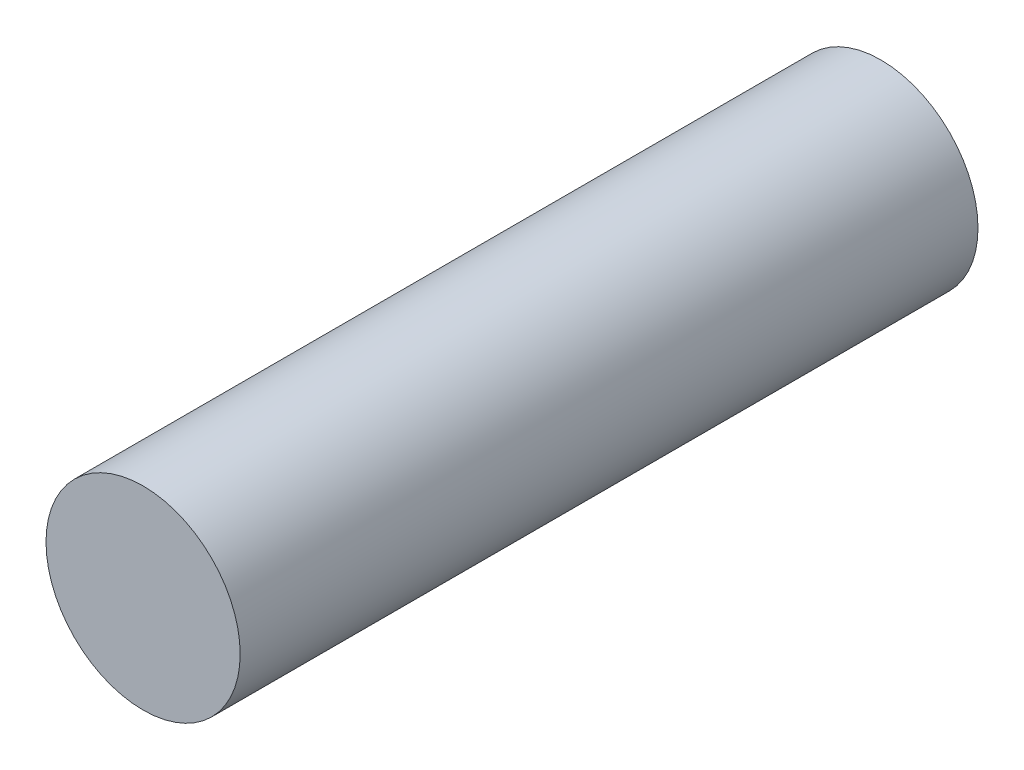
ISO-10303-21;
HEADER;
FILE_DESCRIPTION(('STEP AP214'),'2;1');
FILE_NAME('part.step','',(''),(''),'','','');
FILE_SCHEMA(('AUTOMOTIVE_DESIGN { 1 0 10303 214 1 1 1 1 }'));
ENDSEC;
DATA;
#1=APPLICATION_CONTEXT('core data for automotive mechanical design processes');
#2=APPLICATION_PROTOCOL_DEFINITION('international standard','automotive_design',2000,#1);
#3=PRODUCT_CONTEXT('',#1,'mechanical');
#4=PRODUCT('Part','Part','',(#3));
#5=PRODUCT_RELATED_PRODUCT_CATEGORY('part','',(#4));
#6=PRODUCT_DEFINITION_FORMATION('','',#4);
#7=PRODUCT_DEFINITION_CONTEXT('part definition',#1,'design');
#8=PRODUCT_DEFINITION('design','',#6,#7);
#9=PRODUCT_DEFINITION_SHAPE('','',#8);
#10=(LENGTH_UNIT() NAMED_UNIT(*) SI_UNIT(.MILLI.,.METRE.));
#11=(NAMED_UNIT(*) PLANE_ANGLE_UNIT() SI_UNIT($,.RADIAN.));
#12=(NAMED_UNIT(*) SI_UNIT($,.STERADIAN.) SOLID_ANGLE_UNIT());
#13=UNCERTAINTY_MEASURE_WITH_UNIT(LENGTH_MEASURE(1.E-05),#10,'distance_accuracy_value','');
#14=(GEOMETRIC_REPRESENTATION_CONTEXT(3) GLOBAL_UNCERTAINTY_ASSIGNED_CONTEXT((#13)) GLOBAL_UNIT_ASSIGNED_CONTEXT((#10,
#11,#12)) REPRESENTATION_CONTEXT('',''));
#15=CARTESIAN_POINT('',(0.,0.,0.));
#16=DIRECTION('',(0.,0.,1.));
#17=DIRECTION('',(1.,0.,0.));
#18=AXIS2_PLACEMENT_3D('',#15,#16,#17);
#19=CARTESIAN_POINT('',(0.,0.,19.));
#20=DIRECTION('',(0.,0.,-1.));
#21=DIRECTION('',(-1.,0.,0.));
#22=AXIS2_PLACEMENT_3D('',#19,#20,#21);
#23=CYLINDRICAL_SURFACE('',#22,2.5);
#24=CARTESIAN_POINT('',(0.,0.,19.));
#25=DIRECTION('',(0.,0.,1.));
#26=DIRECTION('',(1.,0.,0.));
#27=AXIS2_PLACEMENT_3D('',#24,#25,#26);
#28=CIRCLE('',#27,2.5);
#29=CARTESIAN_POINT('',(2.5,0.,19.));
#30=VERTEX_POINT('',#29);
#31=EDGE_CURVE('E10',#30,#30,#28,.T.);
#32=ORIENTED_EDGE('',*,*,#31,.F.);
#33=EDGE_LOOP('',(#32));
#34=FACE_BOUND('',#33,.T.);
#35=CARTESIAN_POINT('',(0.,0.,0.));
#36=DIRECTION('',(0.,0.,1.));
#37=DIRECTION('',(1.,0.,0.));
#38=AXIS2_PLACEMENT_3D('',#35,#36,#37);
#39=CIRCLE('',#38,2.5);
#40=CARTESIAN_POINT('',(2.5,0.,0.));
#41=VERTEX_POINT('',#40);
#42=EDGE_CURVE('E34',#41,#41,#39,.T.);
#43=ORIENTED_EDGE('',*,*,#42,.T.);
#44=EDGE_LOOP('',(#43));
#45=FACE_BOUND('',#44,.T.);
#46=ADVANCED_FACE('F31',(#34,#45),#23,.T.);
#47=CARTESIAN_POINT('',(0.,0.,19.));
#48=DIRECTION('',(0.,0.,1.));
#49=DIRECTION('',(1.,0.,0.));
#50=AXIS2_PLACEMENT_3D('',#47,#48,#49);
#51=PLANE('',#50);
#52=ORIENTED_EDGE('',*,*,#31,.T.);
#53=EDGE_LOOP('',(#52));
#54=FACE_BOUND('',#53,.T.);
#55=ADVANCED_FACE('F46',(#54),#51,.T.);
#56=CARTESIAN_POINT('',(0.,0.,0.));
#57=DIRECTION('',(0.,0.,1.));
#58=DIRECTION('',(1.,0.,0.));
#59=AXIS2_PLACEMENT_3D('',#56,#57,#58);
#60=PLANE('',#59);
#61=ORIENTED_EDGE('',*,*,#42,.F.);
#62=EDGE_LOOP('',(#61));
#63=FACE_BOUND('',#62,.T.);
#64=ADVANCED_FACE('F44',(#63),#60,.F.);
#65=CLOSED_SHELL('',(#46,#55,#64));
#66=MANIFOLD_SOLID_BREP('B2',#65);
#67=ADVANCED_BREP_SHAPE_REPRESENTATION('',(#18,#66),#14);
#68=SHAPE_DEFINITION_REPRESENTATION(#9,#67);
ENDSEC;
END-ISO-10303-21;
